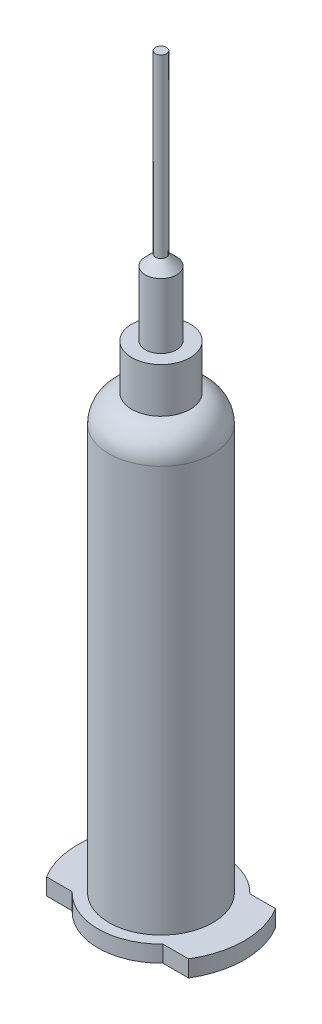
ISO-10303-21;
HEADER;
FILE_DESCRIPTION(('STEP AP214'),'2;1');
FILE_NAME('part.step','',(''),(''),'','','');
FILE_SCHEMA(('AUTOMOTIVE_DESIGN { 1 0 10303 214 1 1 1 1 }'));
ENDSEC;
DATA;
#1=APPLICATION_CONTEXT('core data for automotive mechanical design processes');
#2=APPLICATION_PROTOCOL_DEFINITION('international standard','automotive_design',2000,#1);
#3=PRODUCT_CONTEXT('',#1,'mechanical');
#4=PRODUCT('Part','Part','',(#3));
#5=PRODUCT_RELATED_PRODUCT_CATEGORY('part','',(#4));
#6=PRODUCT_DEFINITION_FORMATION('','',#4);
#7=PRODUCT_DEFINITION_CONTEXT('part definition',#1,'design');
#8=PRODUCT_DEFINITION('design','',#6,#7);
#9=PRODUCT_DEFINITION_SHAPE('','',#8);
#10=(LENGTH_UNIT() NAMED_UNIT(*) SI_UNIT(.MILLI.,.METRE.));
#11=(NAMED_UNIT(*) PLANE_ANGLE_UNIT() SI_UNIT($,.RADIAN.));
#12=(NAMED_UNIT(*) SI_UNIT($,.STERADIAN.) SOLID_ANGLE_UNIT());
#13=UNCERTAINTY_MEASURE_WITH_UNIT(LENGTH_MEASURE(1.E-05),#10,'distance_accuracy_value','');
#14=(GEOMETRIC_REPRESENTATION_CONTEXT(3) GLOBAL_UNCERTAINTY_ASSIGNED_CONTEXT((#13)) GLOBAL_UNIT_ASSIGNED_CONTEXT((#10,
#11,#12)) REPRESENTATION_CONTEXT('',''));
#15=CARTESIAN_POINT('',(0.,0.,0.));
#16=DIRECTION('',(0.,0.,1.));
#17=DIRECTION('',(1.,0.,0.));
#18=AXIS2_PLACEMENT_3D('',#15,#16,#17);
#19=CARTESIAN_POINT('',(0.,24.5223538498266,0.));
#20=DIRECTION('',(0.,1.,0.));
#21=DIRECTION('',(0.,0.,1.));
#22=AXIS2_PLACEMENT_3D('',#19,#20,#21);
#23=CYLINDRICAL_SURFACE('',#22,15.075);
#24=DIRECTION('',(0.,1.,0.));
#25=VECTOR('',#24,1.);
#26=CARTESIAN_POINT('',(-12.8545711713771,-94.1983145535444,-7.875));
#27=LINE('',#26,#25);
#28=CARTESIAN_POINT('',(-12.8545711713771,-67.5,-7.875));
#29=VERTEX_POINT('',#28);
#30=CARTESIAN_POINT('',(-12.8545711713771,-64.5,-7.875));
#31=VERTEX_POINT('',#30);
#32=EDGE_CURVE('E137',#29,#31,#27,.T.);
#33=ORIENTED_EDGE('',*,*,#32,.F.);
#34=CARTESIAN_POINT('',(0.,-67.5,0.));
#35=DIRECTION('',(0.,1.,0.));
#36=DIRECTION('',(0.,0.,1.));
#37=AXIS2_PLACEMENT_3D('',#34,#35,#36);
#38=CIRCLE('',#37,15.075);
#39=CARTESIAN_POINT('',(-12.8545711713772,-67.5,7.875));
#40=VERTEX_POINT('',#39);
#41=EDGE_CURVE('E126',#29,#40,#38,.T.);
#42=ORIENTED_EDGE('',*,*,#41,.T.);
#43=DIRECTION('',(0.,1.,0.));
#44=VECTOR('',#43,1.);
#45=CARTESIAN_POINT('',(-12.8545711713771,-94.1983145535444,7.875));
#46=LINE('',#45,#44);
#47=CARTESIAN_POINT('',(-12.8545711713771,-64.5,7.875));
#48=VERTEX_POINT('',#47);
#49=EDGE_CURVE('E55',#40,#48,#46,.T.);
#50=ORIENTED_EDGE('',*,*,#49,.T.);
#51=CARTESIAN_POINT('',(0.,-64.5,0.));
#52=DIRECTION('',(0.,1.,0.));
#53=DIRECTION('',(0.,0.,1.));
#54=AXIS2_PLACEMENT_3D('',#51,#52,#53);
#55=CIRCLE('',#54,15.075);
#56=EDGE_CURVE('E185',#31,#48,#55,.T.);
#57=ORIENTED_EDGE('',*,*,#56,.F.);
#58=EDGE_LOOP('',(#33,#42,#50,#57));
#59=FACE_BOUND('',#58,.T.);
#60=ADVANCED_FACE('F40',(#59),#23,.T.);
#61=CARTESIAN_POINT('',(0.,24.5223538498266,0.));
#62=DIRECTION('',(0.,1.,0.));
#63=DIRECTION('',(0.,0.,1.));
#64=AXIS2_PLACEMENT_3D('',#61,#62,#63);
#65=CYLINDRICAL_SURFACE('',#64,0.999999999999977);
#66=CARTESIAN_POINT('',(0.,35.6,0.));
#67=DIRECTION('',(0.,1.,0.));
#68=DIRECTION('',(0.,0.,1.));
#69=AXIS2_PLACEMENT_3D('',#66,#67,#68);
#70=CIRCLE('',#69,0.999999999999979);
#71=CARTESIAN_POINT('',(0.,35.6,0.999999999999979));
#72=VERTEX_POINT('',#71);
#73=EDGE_CURVE('E167',#72,#72,#70,.T.);
#74=ORIENTED_EDGE('',*,*,#73,.T.);
#75=EDGE_LOOP('',(#74));
#76=FACE_BOUND('',#75,.T.);
#77=CARTESIAN_POINT('',(0.,67.5,0.));
#78=DIRECTION('',(0.,1.,0.));
#79=DIRECTION('',(0.,0.,1.));
#80=AXIS2_PLACEMENT_3D('',#77,#78,#79);
#81=CIRCLE('',#80,0.999999999999975);
#82=CARTESIAN_POINT('',(0.,67.5,0.999999999999975));
#83=VERTEX_POINT('',#82);
#84=EDGE_CURVE('E140',#83,#83,#81,.T.);
#85=ORIENTED_EDGE('',*,*,#84,.F.);
#86=EDGE_LOOP('',(#85));
#87=FACE_BOUND('',#86,.T.);
#88=ADVANCED_FACE('F226',(#76,#87),#65,.T.);
#89=CARTESIAN_POINT('',(0.,67.5,0.));
#90=DIRECTION('',(0.,1.,0.));
#91=DIRECTION('',(0.,0.,1.));
#92=AXIS2_PLACEMENT_3D('',#89,#90,#91);
#93=PLANE('',#92);
#94=ORIENTED_EDGE('',*,*,#84,.T.);
#95=EDGE_LOOP('',(#94));
#96=FACE_BOUND('',#95,.T.);
#97=ADVANCED_FACE('F227',(#96),#93,.T.);
#98=CARTESIAN_POINT('',(0.,35.6,0.));
#99=DIRECTION('',(0.,-1.,0.));
#100=DIRECTION('',(0.,0.,-1.));
#101=AXIS2_PLACEMENT_3D('',#98,#99,#100);
#102=CONICAL_SURFACE('',#101,0.999999999999979,0.778521094748825);
#103=CARTESIAN_POINT('',(0.,33.7497244794807,0.));
#104=DIRECTION('',(0.,1.,0.));
#105=DIRECTION('',(0.,0.,1.));
#106=AXIS2_PLACEMENT_3D('',#103,#104,#105);
#107=CIRCLE('',#106,2.82500000000001);
#108=CARTESIAN_POINT('',(0.,33.7497244794807,2.82500000000001));
#109=VERTEX_POINT('',#108);
#110=EDGE_CURVE('E170',#109,#109,#107,.T.);
#111=ORIENTED_EDGE('',*,*,#110,.T.);
#112=EDGE_LOOP('',(#111));
#113=FACE_BOUND('',#112,.T.);
#114=ORIENTED_EDGE('',*,*,#73,.F.);
#115=EDGE_LOOP('',(#114));
#116=FACE_BOUND('',#115,.T.);
#117=ADVANCED_FACE('F233',(#113,#116),#102,.T.);
#118=CARTESIAN_POINT('',(0.,24.5223538498266,0.));
#119=DIRECTION('',(0.,1.,0.));
#120=DIRECTION('',(0.,0.,1.));
#121=AXIS2_PLACEMENT_3D('',#118,#119,#120);
#122=CYLINDRICAL_SURFACE('',#121,2.82500000000001);
#123=CARTESIAN_POINT('',(0.,22.,0.));
#124=DIRECTION('',(0.,1.,0.));
#125=DIRECTION('',(0.,0.,1.));
#126=AXIS2_PLACEMENT_3D('',#123,#124,#125);
#127=CIRCLE('',#126,2.82500000000001);
#128=CARTESIAN_POINT('',(0.,22.,2.82500000000001));
#129=VERTEX_POINT('',#128);
#130=EDGE_CURVE('E173',#129,#129,#127,.T.);
#131=ORIENTED_EDGE('',*,*,#130,.T.);
#132=EDGE_LOOP('',(#131));
#133=FACE_BOUND('',#132,.T.);
#134=ORIENTED_EDGE('',*,*,#110,.F.);
#135=EDGE_LOOP('',(#134));
#136=FACE_BOUND('',#135,.T.);
#137=ADVANCED_FACE('F241',(#133,#136),#122,.T.);
#138=CARTESIAN_POINT('',(0.,22.,0.));
#139=DIRECTION('',(0.,1.,0.));
#140=DIRECTION('',(0.,0.,1.));
#141=AXIS2_PLACEMENT_3D('',#138,#139,#140);
#142=PLANE('',#141);
#143=CARTESIAN_POINT('',(0.,22.,0.));
#144=DIRECTION('',(0.,1.,0.));
#145=DIRECTION('',(0.,0.,1.));
#146=AXIS2_PLACEMENT_3D('',#143,#144,#145);
#147=CIRCLE('',#146,5.27500000000001);
#148=CARTESIAN_POINT('',(0.,22.,5.27500000000001));
#149=VERTEX_POINT('',#148);
#150=EDGE_CURVE('E176',#149,#149,#147,.T.);
#151=ORIENTED_EDGE('',*,*,#150,.T.);
#152=EDGE_LOOP('',(#151));
#153=FACE_BOUND('',#152,.T.);
#154=ORIENTED_EDGE('',*,*,#130,.F.);
#155=EDGE_LOOP('',(#154));
#156=FACE_BOUND('',#155,.T.);
#157=ADVANCED_FACE('F250',(#153,#156),#142,.T.);
#158=CARTESIAN_POINT('',(0.,24.5223538498266,0.));
#159=DIRECTION('',(0.,1.,0.));
#160=DIRECTION('',(0.,0.,1.));
#161=AXIS2_PLACEMENT_3D('',#158,#159,#160);
#162=CYLINDRICAL_SURFACE('',#161,5.27500000000001);
#163=CARTESIAN_POINT('',(0.,13.9,0.));
#164=DIRECTION('',(0.,1.,0.));
#165=DIRECTION('',(0.,0.,1.));
#166=AXIS2_PLACEMENT_3D('',#163,#164,#165);
#167=CIRCLE('',#166,5.27500000000001);
#168=CARTESIAN_POINT('',(0.,13.9,5.27500000000001));
#169=VERTEX_POINT('',#168);
#170=EDGE_CURVE('E179',#169,#169,#167,.T.);
#171=ORIENTED_EDGE('',*,*,#170,.T.);
#172=EDGE_LOOP('',(#171));
#173=FACE_BOUND('',#172,.T.);
#174=ORIENTED_EDGE('',*,*,#150,.F.);
#175=EDGE_LOOP('',(#174));
#176=FACE_BOUND('',#175,.T.);
#177=ADVANCED_FACE('F254',(#173,#176),#162,.T.);
#178=CARTESIAN_POINT('',(0.,24.5223538498266,0.));
#179=DIRECTION('',(0.,1.,0.));
#180=DIRECTION('',(0.,0.,1.));
#181=AXIS2_PLACEMENT_3D('',#178,#179,#180);
#182=CYLINDRICAL_SURFACE('',#181,9.40000000000001);
#183=CARTESIAN_POINT('',(0.,8.9771578331212,0.));
#184=DIRECTION('',(0.,1.,0.));
#185=DIRECTION('',(0.,0.,1.));
#186=AXIS2_PLACEMENT_3D('',#183,#184,#185);
#187=CIRCLE('',#186,9.40000000000001);
#188=CARTESIAN_POINT('',(0.,8.9771578331212,9.40000000000001));
#189=VERTEX_POINT('',#188);
#190=EDGE_CURVE('E12',#189,#189,#187,.F.);
#191=ORIENTED_EDGE('',*,*,#190,.T.);
#192=EDGE_LOOP('',(#191));
#193=FACE_BOUND('',#192,.T.);
#194=CARTESIAN_POINT('',(0.,-64.5,0.));
#195=DIRECTION('',(0.,1.,0.));
#196=DIRECTION('',(0.,0.,1.));
#197=AXIS2_PLACEMENT_3D('',#194,#195,#196);
#198=CIRCLE('',#197,9.40000000000002);
#199=CARTESIAN_POINT('',(0.,-64.5,9.40000000000002));
#200=VERTEX_POINT('',#199);
#201=EDGE_CURVE('E182',#200,#200,#198,.T.);
#202=ORIENTED_EDGE('',*,*,#201,.T.);
#203=EDGE_LOOP('',(#202));
#204=FACE_BOUND('',#203,.T.);
#205=ADVANCED_FACE('F258',(#193,#204),#182,.T.);
#206=CARTESIAN_POINT('',(0.,-64.5,0.));
#207=DIRECTION('',(0.,1.,0.));
#208=DIRECTION('',(0.,0.,1.));
#209=AXIS2_PLACEMENT_3D('',#206,#207,#208);
#210=PLANE('',#209);
#211=DIRECTION('',(1.,0.,0.));
#212=VECTOR('',#211,1.);
#213=CARTESIAN_POINT('',(-12.8545711713771,-64.5,-7.875));
#214=LINE('',#213,#212);
#215=CARTESIAN_POINT('',(-8.208227579691,-64.5,-7.875));
#216=VERTEX_POINT('',#215);
#217=EDGE_CURVE('E120',#31,#216,#214,.T.);
#218=ORIENTED_EDGE('',*,*,#217,.F.);
#219=ORIENTED_EDGE('',*,*,#56,.T.);
#220=DIRECTION('',(-1.,0.,0.));
#221=VECTOR('',#220,1.);
#222=CARTESIAN_POINT('',(-12.8545711713771,-64.5,7.875));
#223=LINE('',#222,#221);
#224=CARTESIAN_POINT('',(-8.208227579691,-64.5,7.875));
#225=VERTEX_POINT('',#224);
#226=EDGE_CURVE('E157',#225,#48,#223,.T.);
#227=ORIENTED_EDGE('',*,*,#226,.F.);
#228=CARTESIAN_POINT('',(0.,-64.5,0.));
#229=DIRECTION('',(0.,-1.,0.));
#230=DIRECTION('',(0.,0.,1.));
#231=AXIS2_PLACEMENT_3D('',#228,#229,#230);
#232=CIRCLE('',#231,11.375);
#233=CARTESIAN_POINT('',(8.208227579691,-64.5,7.875));
#234=VERTEX_POINT('',#233);
#235=EDGE_CURVE('E161',#234,#225,#232,.T.);
#236=ORIENTED_EDGE('',*,*,#235,.F.);
#237=DIRECTION('',(-1.,0.,0.));
#238=VECTOR('',#237,1.);
#239=CARTESIAN_POINT('',(8.208227579691,-64.5,7.875));
#240=LINE('',#239,#238);
#241=CARTESIAN_POINT('',(12.8545711713771,-64.5,7.875));
#242=VERTEX_POINT('',#241);
#243=EDGE_CURVE('E158',#242,#234,#240,.T.);
#244=ORIENTED_EDGE('',*,*,#243,.F.);
#245=CARTESIAN_POINT('',(12.8545711713771,-64.5,-7.875));
#246=VERTEX_POINT('',#245);
#247=EDGE_CURVE('E186',#242,#246,#55,.T.);
#248=ORIENTED_EDGE('',*,*,#247,.T.);
#249=DIRECTION('',(1.,0.,0.));
#250=VECTOR('',#249,1.);
#251=CARTESIAN_POINT('',(8.208227579691,-64.5,-7.875));
#252=LINE('',#251,#250);
#253=CARTESIAN_POINT('',(8.208227579691,-64.5,-7.875));
#254=VERTEX_POINT('',#253);
#255=EDGE_CURVE('E127',#254,#246,#252,.T.);
#256=ORIENTED_EDGE('',*,*,#255,.F.);
#257=CARTESIAN_POINT('',(0.,-64.5,0.));
#258=DIRECTION('',(0.,-1.,0.));
#259=DIRECTION('',(0.,0.,-1.));
#260=AXIS2_PLACEMENT_3D('',#257,#258,#259);
#261=CIRCLE('',#260,11.375);
#262=EDGE_CURVE('E129',#216,#254,#261,.T.);
#263=ORIENTED_EDGE('',*,*,#262,.F.);
#264=EDGE_LOOP('',(#218,#219,#227,#236,#244,#248,#256,#263));
#265=FACE_BOUND('',#264,.T.);
#266=ORIENTED_EDGE('',*,*,#201,.F.);
#267=EDGE_LOOP('',(#266));
#268=FACE_BOUND('',#267,.T.);
#269=ADVANCED_FACE('F196',(#265,#268),#210,.T.);
#270=DIRECTION('',(0.,1.,0.));
#271=VECTOR('',#270,1.);
#272=CARTESIAN_POINT('',(12.8545711713771,-94.1983145535444,-7.875));
#273=LINE('',#272,#271);
#274=CARTESIAN_POINT('',(12.8545711713772,-67.5,-7.875));
#275=VERTEX_POINT('',#274);
#276=EDGE_CURVE('E63',#275,#246,#273,.T.);
#277=ORIENTED_EDGE('',*,*,#276,.T.);
#278=ORIENTED_EDGE('',*,*,#247,.F.);
#279=DIRECTION('',(0.,1.,0.));
#280=VECTOR('',#279,1.);
#281=CARTESIAN_POINT('',(12.8545711713771,-94.1983145535444,7.875));
#282=LINE('',#281,#280);
#283=CARTESIAN_POINT('',(12.8545711713771,-67.5,7.875));
#284=VERTEX_POINT('',#283);
#285=EDGE_CURVE('E141',#284,#242,#282,.T.);
#286=ORIENTED_EDGE('',*,*,#285,.F.);
#287=EDGE_CURVE('E48',#284,#275,#38,.T.);
#288=ORIENTED_EDGE('',*,*,#287,.T.);
#289=EDGE_LOOP('',(#277,#278,#286,#288));
#290=FACE_BOUND('',#289,.T.);
#291=ADVANCED_FACE('F217',(#290),#23,.T.);
#292=CARTESIAN_POINT('',(0.,-67.5,0.));
#293=DIRECTION('',(0.,-1.,0.));
#294=DIRECTION('',(0.,0.,-1.));
#295=AXIS2_PLACEMENT_3D('',#292,#293,#294);
#296=PLANE('',#295);
#297=CARTESIAN_POINT('',(0.,-67.5,0.));
#298=DIRECTION('',(0.,-1.,0.));
#299=DIRECTION('',(0.,0.,-1.));
#300=AXIS2_PLACEMENT_3D('',#297,#298,#299);
#301=CIRCLE('',#300,7.925);
#302=CARTESIAN_POINT('',(0.,-67.5,-7.925));
#303=VERTEX_POINT('',#302);
#304=EDGE_CURVE('E201',#303,#303,#301,.T.);
#305=ORIENTED_EDGE('',*,*,#304,.F.);
#306=EDGE_LOOP('',(#305));
#307=FACE_BOUND('',#306,.T.);
#308=DIRECTION('',(1.,0.,0.));
#309=VECTOR('',#308,1.);
#310=CARTESIAN_POINT('',(-12.8545711713771,-67.5,-7.875));
#311=LINE('',#310,#309);
#312=CARTESIAN_POINT('',(-8.208227579691,-67.5,-7.875));
#313=VERTEX_POINT('',#312);
#314=EDGE_CURVE('E117',#29,#313,#311,.T.);
#315=ORIENTED_EDGE('',*,*,#314,.T.);
#316=CARTESIAN_POINT('',(0.,-67.5,0.));
#317=DIRECTION('',(0.,-1.,0.));
#318=DIRECTION('',(0.,0.,-1.));
#319=AXIS2_PLACEMENT_3D('',#316,#317,#318);
#320=CIRCLE('',#319,11.375);
#321=CARTESIAN_POINT('',(8.208227579691,-67.5,-7.875));
#322=VERTEX_POINT('',#321);
#323=EDGE_CURVE('E105',#313,#322,#320,.T.);
#324=ORIENTED_EDGE('',*,*,#323,.T.);
#325=DIRECTION('',(1.,0.,0.));
#326=VECTOR('',#325,1.);
#327=CARTESIAN_POINT('',(8.208227579691,-67.5,-7.875));
#328=LINE('',#327,#326);
#329=EDGE_CURVE('E134',#322,#275,#328,.T.);
#330=ORIENTED_EDGE('',*,*,#329,.T.);
#331=ORIENTED_EDGE('',*,*,#287,.F.);
#332=DIRECTION('',(-1.,0.,0.));
#333=VECTOR('',#332,1.);
#334=CARTESIAN_POINT('',(8.208227579691,-67.5,7.875));
#335=LINE('',#334,#333);
#336=CARTESIAN_POINT('',(8.208227579691,-67.5,7.875));
#337=VERTEX_POINT('',#336);
#338=EDGE_CURVE('E146',#284,#337,#335,.T.);
#339=ORIENTED_EDGE('',*,*,#338,.T.);
#340=CARTESIAN_POINT('',(0.,-67.5,0.));
#341=DIRECTION('',(0.,-1.,0.));
#342=DIRECTION('',(0.,0.,-1.));
#343=AXIS2_PLACEMENT_3D('',#340,#341,#342);
#344=CIRCLE('',#343,11.375);
#345=CARTESIAN_POINT('',(-8.208227579691,-67.5,7.875));
#346=VERTEX_POINT('',#345);
#347=EDGE_CURVE('E147',#337,#346,#344,.T.);
#348=ORIENTED_EDGE('',*,*,#347,.T.);
#349=DIRECTION('',(-1.,0.,0.));
#350=VECTOR('',#349,1.);
#351=CARTESIAN_POINT('',(-12.8545711713771,-67.5,7.875));
#352=LINE('',#351,#350);
#353=EDGE_CURVE('E150',#346,#40,#352,.T.);
#354=ORIENTED_EDGE('',*,*,#353,.T.);
#355=ORIENTED_EDGE('',*,*,#41,.F.);
#356=EDGE_LOOP('',(#315,#324,#330,#331,#339,#348,#354,#355));
#357=FACE_BOUND('',#356,.T.);
#358=ADVANCED_FACE('F124',(#307,#357),#296,.T.);
#359=CARTESIAN_POINT('',(0.,8.9771578331212,0.));
#360=DIRECTION('',(0.,1.,0.));
#361=DIRECTION('',(0.,0.,1.));
#362=AXIS2_PLACEMENT_3D('',#359,#360,#361);
#363=DEGENERATE_TOROIDAL_SURFACE('',#362,4.40000000000001,5.,.T.);
#364=ORIENTED_EDGE('',*,*,#190,.F.);
#365=EDGE_LOOP('',(#364));
#366=FACE_BOUND('',#365,.T.);
#367=ORIENTED_EDGE('',*,*,#170,.F.);
#368=EDGE_LOOP('',(#367));
#369=FACE_BOUND('',#368,.T.);
#370=ADVANCED_FACE('F42',(#366,#369),#363,.T.);
#371=CARTESIAN_POINT('',(8.208227579691,-94.1983145535444,7.875));
#372=DIRECTION('',(0.,0.,-1.));
#373=DIRECTION('',(-1.,0.,0.));
#374=AXIS2_PLACEMENT_3D('',#371,#372,#373);
#375=PLANE('',#374);
#376=ORIENTED_EDGE('',*,*,#285,.T.);
#377=ORIENTED_EDGE('',*,*,#243,.T.);
#378=DIRECTION('',(0.,1.,0.));
#379=VECTOR('',#378,1.);
#380=CARTESIAN_POINT('',(8.208227579691,-94.1983145535444,7.875));
#381=LINE('',#380,#379);
#382=EDGE_CURVE('E144',#337,#234,#381,.T.);
#383=ORIENTED_EDGE('',*,*,#382,.F.);
#384=ORIENTED_EDGE('',*,*,#338,.F.);
#385=EDGE_LOOP('',(#376,#377,#383,#384));
#386=FACE_BOUND('',#385,.T.);
#387=ADVANCED_FACE('F222',(#386),#375,.F.);
#388=CARTESIAN_POINT('',(0.,-94.1983145535444,0.));
#389=DIRECTION('',(0.,1.,0.));
#390=DIRECTION('',(0.,0.,1.));
#391=AXIS2_PLACEMENT_3D('',#388,#389,#390);
#392=CYLINDRICAL_SURFACE('',#391,11.375);
#393=ORIENTED_EDGE('',*,*,#382,.T.);
#394=ORIENTED_EDGE('',*,*,#235,.T.);
#395=DIRECTION('',(0.,1.,0.));
#396=VECTOR('',#395,1.);
#397=CARTESIAN_POINT('',(-8.208227579691,-94.1983145535444,7.875));
#398=LINE('',#397,#396);
#399=EDGE_CURVE('E148',#346,#225,#398,.T.);
#400=ORIENTED_EDGE('',*,*,#399,.F.);
#401=ORIENTED_EDGE('',*,*,#347,.F.);
#402=EDGE_LOOP('',(#393,#394,#400,#401));
#403=FACE_BOUND('',#402,.T.);
#404=ADVANCED_FACE('F282',(#403),#392,.T.);
#405=CARTESIAN_POINT('',(-12.8545711713771,-94.1983145535444,7.875));
#406=DIRECTION('',(0.,0.,-1.));
#407=DIRECTION('',(-1.,0.,0.));
#408=AXIS2_PLACEMENT_3D('',#405,#406,#407);
#409=PLANE('',#408);
#410=ORIENTED_EDGE('',*,*,#399,.T.);
#411=ORIENTED_EDGE('',*,*,#226,.T.);
#412=ORIENTED_EDGE('',*,*,#49,.F.);
#413=ORIENTED_EDGE('',*,*,#353,.F.);
#414=EDGE_LOOP('',(#410,#411,#412,#413));
#415=FACE_BOUND('',#414,.T.);
#416=ADVANCED_FACE('F245',(#415),#409,.F.);
#417=CARTESIAN_POINT('',(-12.8545711713771,-94.1983145535444,-7.875));
#418=DIRECTION('',(0.,0.,1.));
#419=DIRECTION('',(1.,0.,0.));
#420=AXIS2_PLACEMENT_3D('',#417,#418,#419);
#421=PLANE('',#420);
#422=ORIENTED_EDGE('',*,*,#32,.T.);
#423=ORIENTED_EDGE('',*,*,#217,.T.);
#424=DIRECTION('',(0.,1.,0.));
#425=VECTOR('',#424,1.);
#426=CARTESIAN_POINT('',(-8.208227579691,-94.1983145535444,-7.875));
#427=LINE('',#426,#425);
#428=EDGE_CURVE('E109',#313,#216,#427,.T.);
#429=ORIENTED_EDGE('',*,*,#428,.F.);
#430=ORIENTED_EDGE('',*,*,#314,.F.);
#431=EDGE_LOOP('',(#422,#423,#429,#430));
#432=FACE_BOUND('',#431,.T.);
#433=ADVANCED_FACE('F116',(#432),#421,.F.);
#434=CARTESIAN_POINT('',(0.,-94.1983145535444,0.));
#435=DIRECTION('',(0.,1.,0.));
#436=DIRECTION('',(0.,0.,1.));
#437=AXIS2_PLACEMENT_3D('',#434,#435,#436);
#438=CYLINDRICAL_SURFACE('',#437,11.375);
#439=ORIENTED_EDGE('',*,*,#428,.T.);
#440=ORIENTED_EDGE('',*,*,#262,.T.);
#441=DIRECTION('',(0.,1.,0.));
#442=VECTOR('',#441,1.);
#443=CARTESIAN_POINT('',(8.208227579691,-94.1983145535444,-7.875));
#444=LINE('',#443,#442);
#445=EDGE_CURVE('E111',#322,#254,#444,.T.);
#446=ORIENTED_EDGE('',*,*,#445,.F.);
#447=ORIENTED_EDGE('',*,*,#323,.F.);
#448=EDGE_LOOP('',(#439,#440,#446,#447));
#449=FACE_BOUND('',#448,.T.);
#450=ADVANCED_FACE('F107',(#449),#438,.T.);
#451=CARTESIAN_POINT('',(8.208227579691,-94.1983145535444,-7.875));
#452=DIRECTION('',(0.,0.,1.));
#453=DIRECTION('',(1.,0.,0.));
#454=AXIS2_PLACEMENT_3D('',#451,#452,#453);
#455=PLANE('',#454);
#456=ORIENTED_EDGE('',*,*,#445,.T.);
#457=ORIENTED_EDGE('',*,*,#255,.T.);
#458=ORIENTED_EDGE('',*,*,#276,.F.);
#459=ORIENTED_EDGE('',*,*,#329,.F.);
#460=EDGE_LOOP('',(#456,#457,#458,#459));
#461=FACE_BOUND('',#460,.T.);
#462=ADVANCED_FACE('F212',(#461),#455,.F.);
#463=CARTESIAN_POINT('',(0.,-47.5,0.));
#464=DIRECTION('',(0.,-1.,0.));
#465=DIRECTION('',(0.,0.,-1.));
#466=AXIS2_PLACEMENT_3D('',#463,#464,#465);
#467=CYLINDRICAL_SURFACE('',#466,7.925);
#468=CARTESIAN_POINT('',(0.,-47.5,0.));
#469=DIRECTION('',(0.,-1.,0.));
#470=DIRECTION('',(0.,0.,-1.));
#471=AXIS2_PLACEMENT_3D('',#468,#469,#470);
#472=CIRCLE('',#471,7.925);
#473=CARTESIAN_POINT('',(0.,-47.5,-7.925));
#474=VERTEX_POINT('',#473);
#475=EDGE_CURVE('E143',#474,#474,#472,.T.);
#476=ORIENTED_EDGE('',*,*,#475,.F.);
#477=EDGE_LOOP('',(#476));
#478=FACE_BOUND('',#477,.T.);
#479=ORIENTED_EDGE('',*,*,#304,.T.);
#480=EDGE_LOOP('',(#479));
#481=FACE_BOUND('',#480,.T.);
#482=ADVANCED_FACE('F209',(#478,#481),#467,.F.);
#483=CARTESIAN_POINT('',(0.,-47.5,0.));
#484=DIRECTION('',(0.,-1.,0.));
#485=DIRECTION('',(0.,0.,-1.));
#486=AXIS2_PLACEMENT_3D('',#483,#484,#485);
#487=PLANE('',#486);
#488=ORIENTED_EDGE('',*,*,#475,.T.);
#489=EDGE_LOOP('',(#488));
#490=FACE_BOUND('',#489,.T.);
#491=ADVANCED_FACE('F207',(#490),#487,.T.);
#492=CLOSED_SHELL('',(#60,#88,#97,#117,#137,#157,#177,#205,#269,#291,#358,#370,#387,#404,#416,
#433,#450,#462,#482,#491));
#493=MANIFOLD_SOLID_BREP('B2',#492);
#494=ADVANCED_BREP_SHAPE_REPRESENTATION('',(#18,#493),#14);
#495=SHAPE_DEFINITION_REPRESENTATION(#9,#494);
ENDSEC;
END-ISO-10303-21;
